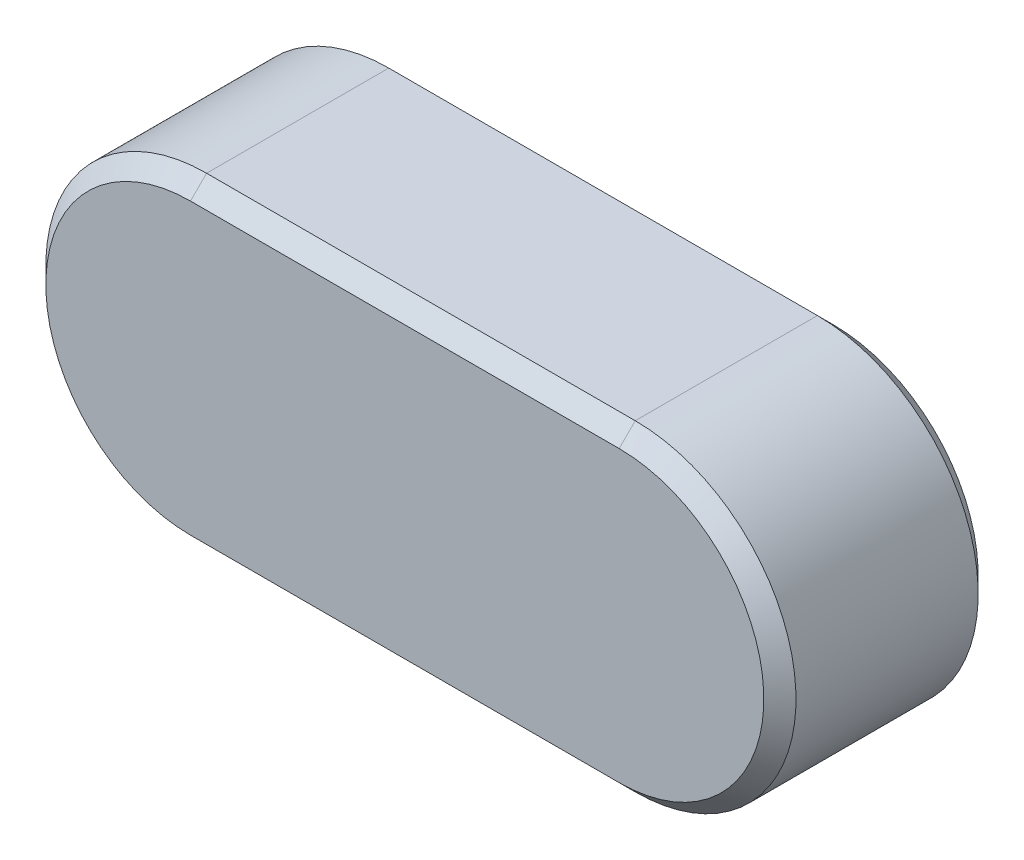
ISO-10303-21;
HEADER;
FILE_DESCRIPTION(('STEP AP214'),'2;1');
FILE_NAME('part.step','',(''),(''),'','','');
FILE_SCHEMA(('AUTOMOTIVE_DESIGN { 1 0 10303 214 1 1 1 1 }'));
ENDSEC;
DATA;
#1=APPLICATION_CONTEXT('core data for automotive mechanical design processes');
#2=APPLICATION_PROTOCOL_DEFINITION('international standard','automotive_design',2000,#1);
#3=PRODUCT_CONTEXT('',#1,'mechanical');
#4=PRODUCT('Part','Part','',(#3));
#5=PRODUCT_RELATED_PRODUCT_CATEGORY('part','',(#4));
#6=PRODUCT_DEFINITION_FORMATION('','',#4);
#7=PRODUCT_DEFINITION_CONTEXT('part definition',#1,'design');
#8=PRODUCT_DEFINITION('design','',#6,#7);
#9=PRODUCT_DEFINITION_SHAPE('','',#8);
#10=(LENGTH_UNIT() NAMED_UNIT(*) SI_UNIT(.MILLI.,.METRE.));
#11=(NAMED_UNIT(*) PLANE_ANGLE_UNIT() SI_UNIT($,.RADIAN.));
#12=(NAMED_UNIT(*) SI_UNIT($,.STERADIAN.) SOLID_ANGLE_UNIT());
#13=UNCERTAINTY_MEASURE_WITH_UNIT(LENGTH_MEASURE(1.E-05),#10,'distance_accuracy_value','');
#14=(GEOMETRIC_REPRESENTATION_CONTEXT(3) GLOBAL_UNCERTAINTY_ASSIGNED_CONTEXT((#13)) GLOBAL_UNIT_ASSIGNED_CONTEXT((#10,
#11,#12)) REPRESENTATION_CONTEXT('',''));
#15=CARTESIAN_POINT('',(0.,0.,0.));
#16=DIRECTION('',(0.,0.,1.));
#17=DIRECTION('',(1.,0.,0.));
#18=AXIS2_PLACEMENT_3D('',#15,#16,#17);
#19=CARTESIAN_POINT('',(-16.,0.,4.));
#20=DIRECTION('',(0.,0.,-1.));
#21=DIRECTION('',(-1.,0.,0.));
#22=AXIS2_PLACEMENT_3D('',#19,#20,#21);
#23=CYLINDRICAL_SURFACE('',#22,6.);
#24=DIRECTION('',(0.,0.,-1.));
#25=VECTOR('',#24,1.);
#26=CARTESIAN_POINT('',(-16.,-6.,4.));
#27=LINE('',#26,#25);
#28=CARTESIAN_POINT('',(-16.,-6.,3.4));
#29=VERTEX_POINT('',#28);
#30=CARTESIAN_POINT('',(-16.,-6.,-3.39999999999999));
#31=VERTEX_POINT('',#30);
#32=EDGE_CURVE('E123',#29,#31,#27,.T.);
#33=ORIENTED_EDGE('',*,*,#32,.F.);
#34=CARTESIAN_POINT('',(-16.,0.,3.4));
#35=DIRECTION('',(0.,0.,-1.));
#36=DIRECTION('',(-1.,0.,0.));
#37=AXIS2_PLACEMENT_3D('',#34,#35,#36);
#38=CIRCLE('',#37,6.);
#39=CARTESIAN_POINT('',(-16.,6.,3.4));
#40=VERTEX_POINT('',#39);
#41=EDGE_CURVE('E57',#29,#40,#38,.T.);
#42=ORIENTED_EDGE('',*,*,#41,.T.);
#43=DIRECTION('',(0.,0.,-1.));
#44=VECTOR('',#43,1.);
#45=CARTESIAN_POINT('',(-16.,6.,4.));
#46=LINE('',#45,#44);
#47=CARTESIAN_POINT('',(-16.,6.,-3.39999999999999));
#48=VERTEX_POINT('',#47);
#49=EDGE_CURVE('E161',#40,#48,#46,.T.);
#50=ORIENTED_EDGE('',*,*,#49,.T.);
#51=CARTESIAN_POINT('',(-16.,0.,-3.39999999999999));
#52=DIRECTION('',(0.,0.,-1.));
#53=DIRECTION('',(-1.,0.,0.));
#54=AXIS2_PLACEMENT_3D('',#51,#52,#53);
#55=CIRCLE('',#54,6.);
#56=EDGE_CURVE('E111',#48,#31,#55,.F.);
#57=ORIENTED_EDGE('',*,*,#56,.T.);
#58=EDGE_LOOP('',(#33,#42,#50,#57));
#59=FACE_BOUND('',#58,.T.);
#60=ADVANCED_FACE('F34',(#59),#23,.T.);
#61=CARTESIAN_POINT('',(0.,-6.,4.));
#62=DIRECTION('',(0.,1.,0.));
#63=DIRECTION('',(-1.,0.,0.));
#64=AXIS2_PLACEMENT_3D('',#61,#62,#63);
#65=PLANE('',#64);
#66=ORIENTED_EDGE('',*,*,#32,.T.);
#67=DIRECTION('',(1.,0.,0.));
#68=VECTOR('',#67,1.);
#69=CARTESIAN_POINT('',(0.,-6.,-3.39999999999999));
#70=LINE('',#69,#68);
#71=CARTESIAN_POINT('',(0.,-6.,-3.39999999999999));
#72=VERTEX_POINT('',#71);
#73=EDGE_CURVE('E122',#31,#72,#70,.T.);
#74=ORIENTED_EDGE('',*,*,#73,.T.);
#75=DIRECTION('',(0.,0.,-1.));
#76=VECTOR('',#75,1.);
#77=CARTESIAN_POINT('',(0.,-6.,4.));
#78=LINE('',#77,#76);
#79=CARTESIAN_POINT('',(0.,-6.,3.4));
#80=VERTEX_POINT('',#79);
#81=EDGE_CURVE('E105',#80,#72,#78,.T.);
#82=ORIENTED_EDGE('',*,*,#81,.F.);
#83=DIRECTION('',(-1.,0.,0.));
#84=VECTOR('',#83,1.);
#85=CARTESIAN_POINT('',(0.,-6.,3.4));
#86=LINE('',#85,#84);
#87=EDGE_CURVE('E120',#80,#29,#86,.T.);
#88=ORIENTED_EDGE('',*,*,#87,.T.);
#89=EDGE_LOOP('',(#66,#74,#82,#88));
#90=FACE_BOUND('',#89,.T.);
#91=ADVANCED_FACE('F119',(#90),#65,.F.);
#92=CARTESIAN_POINT('',(0.,0.,4.));
#93=DIRECTION('',(0.,0.,-1.));
#94=DIRECTION('',(-1.,0.,0.));
#95=AXIS2_PLACEMENT_3D('',#92,#93,#94);
#96=CYLINDRICAL_SURFACE('',#95,6.);
#97=DIRECTION('',(0.,0.,-1.));
#98=VECTOR('',#97,1.);
#99=CARTESIAN_POINT('',(0.,6.,4.));
#100=LINE('',#99,#98);
#101=CARTESIAN_POINT('',(0.,6.,3.4));
#102=VERTEX_POINT('',#101);
#103=CARTESIAN_POINT('',(0.,6.,-3.39999999999999));
#104=VERTEX_POINT('',#103);
#105=EDGE_CURVE('E106',#102,#104,#100,.T.);
#106=ORIENTED_EDGE('',*,*,#105,.F.);
#107=CARTESIAN_POINT('',(0.,0.,3.4));
#108=DIRECTION('',(0.,0.,-1.));
#109=DIRECTION('',(-1.,0.,0.));
#110=AXIS2_PLACEMENT_3D('',#107,#108,#109);
#111=CIRCLE('',#110,6.);
#112=EDGE_CURVE('E102',#102,#80,#111,.T.);
#113=ORIENTED_EDGE('',*,*,#112,.T.);
#114=ORIENTED_EDGE('',*,*,#81,.T.);
#115=CARTESIAN_POINT('',(0.,0.,-3.39999999999999));
#116=DIRECTION('',(0.,0.,-1.));
#117=DIRECTION('',(-1.,0.,0.));
#118=AXIS2_PLACEMENT_3D('',#115,#116,#117);
#119=CIRCLE('',#118,6.);
#120=EDGE_CURVE('E112',#72,#104,#119,.F.);
#121=ORIENTED_EDGE('',*,*,#120,.T.);
#122=EDGE_LOOP('',(#106,#113,#114,#121));
#123=FACE_BOUND('',#122,.T.);
#124=ADVANCED_FACE('F104',(#123),#96,.T.);
#125=CARTESIAN_POINT('',(-16.,6.,4.));
#126=DIRECTION('',(0.,-1.,0.));
#127=DIRECTION('',(1.,0.,0.));
#128=AXIS2_PLACEMENT_3D('',#125,#126,#127);
#129=PLANE('',#128);
#130=ORIENTED_EDGE('',*,*,#49,.F.);
#131=DIRECTION('',(1.,0.,0.));
#132=VECTOR('',#131,1.);
#133=CARTESIAN_POINT('',(-16.,6.,3.4));
#134=LINE('',#133,#132);
#135=EDGE_CURVE('E11',#40,#102,#134,.T.);
#136=ORIENTED_EDGE('',*,*,#135,.T.);
#137=ORIENTED_EDGE('',*,*,#105,.T.);
#138=DIRECTION('',(-1.,0.,0.));
#139=VECTOR('',#138,1.);
#140=CARTESIAN_POINT('',(-16.,6.,-3.39999999999999));
#141=LINE('',#140,#139);
#142=EDGE_CURVE('E43',#104,#48,#141,.T.);
#143=ORIENTED_EDGE('',*,*,#142,.T.);
#144=EDGE_LOOP('',(#130,#136,#137,#143));
#145=FACE_BOUND('',#144,.T.);
#146=ADVANCED_FACE('F211',(#145),#129,.F.);
#147=CARTESIAN_POINT('',(-16.,0.,4.));
#148=DIRECTION('',(0.,0.,-1.));
#149=DIRECTION('',(-1.,0.,0.));
#150=AXIS2_PLACEMENT_3D('',#147,#148,#149);
#151=PLANE('',#150);
#152=CARTESIAN_POINT('',(-16.,0.,4.));
#153=DIRECTION('',(0.,0.,-1.));
#154=DIRECTION('',(-1.,0.,0.));
#155=AXIS2_PLACEMENT_3D('',#152,#153,#154);
#156=CIRCLE('',#155,5.4);
#157=CARTESIAN_POINT('',(-16.,5.4,4.));
#158=VERTEX_POINT('',#157);
#159=CARTESIAN_POINT('',(-16.,-5.4,4.));
#160=VERTEX_POINT('',#159);
#161=EDGE_CURVE('E182',#158,#160,#156,.F.);
#162=ORIENTED_EDGE('',*,*,#161,.T.);
#163=DIRECTION('',(1.,0.,0.));
#164=VECTOR('',#163,1.);
#165=CARTESIAN_POINT('',(-16.,-5.4,4.));
#166=LINE('',#165,#164);
#167=CARTESIAN_POINT('',(0.,-5.4,4.));
#168=VERTEX_POINT('',#167);
#169=EDGE_CURVE('E185',#160,#168,#166,.T.);
#170=ORIENTED_EDGE('',*,*,#169,.T.);
#171=CARTESIAN_POINT('',(0.,0.,4.));
#172=DIRECTION('',(0.,0.,-1.));
#173=DIRECTION('',(-1.,0.,0.));
#174=AXIS2_PLACEMENT_3D('',#171,#172,#173);
#175=CIRCLE('',#174,5.4);
#176=CARTESIAN_POINT('',(0.,5.4,4.));
#177=VERTEX_POINT('',#176);
#178=EDGE_CURVE('E134',#168,#177,#175,.F.);
#179=ORIENTED_EDGE('',*,*,#178,.T.);
#180=DIRECTION('',(-1.,0.,0.));
#181=VECTOR('',#180,1.);
#182=CARTESIAN_POINT('',(-16.,5.4,4.));
#183=LINE('',#182,#181);
#184=EDGE_CURVE('E180',#177,#158,#183,.T.);
#185=ORIENTED_EDGE('',*,*,#184,.T.);
#186=EDGE_LOOP('',(#162,#170,#179,#185));
#187=FACE_BOUND('',#186,.T.);
#188=ADVANCED_FACE('F214',(#187),#151,.F.);
#189=CARTESIAN_POINT('',(-16.,0.,-4.));
#190=DIRECTION('',(0.,0.,-1.));
#191=DIRECTION('',(-1.,0.,0.));
#192=AXIS2_PLACEMENT_3D('',#189,#190,#191);
#193=PLANE('',#192);
#194=CARTESIAN_POINT('',(0.,0.,-4.));
#195=DIRECTION('',(0.,0.,-1.));
#196=DIRECTION('',(-1.,0.,0.));
#197=AXIS2_PLACEMENT_3D('',#194,#195,#196);
#198=CIRCLE('',#197,5.4);
#199=CARTESIAN_POINT('',(0.,5.4,-4.));
#200=VERTEX_POINT('',#199);
#201=CARTESIAN_POINT('',(0.,-5.4,-4.));
#202=VERTEX_POINT('',#201);
#203=EDGE_CURVE('E175',#200,#202,#198,.T.);
#204=ORIENTED_EDGE('',*,*,#203,.T.);
#205=DIRECTION('',(-1.,0.,0.));
#206=VECTOR('',#205,1.);
#207=CARTESIAN_POINT('',(-16.,-5.4,-4.));
#208=LINE('',#207,#206);
#209=CARTESIAN_POINT('',(-16.,-5.4,-4.));
#210=VERTEX_POINT('',#209);
#211=EDGE_CURVE('E177',#202,#210,#208,.T.);
#212=ORIENTED_EDGE('',*,*,#211,.T.);
#213=CARTESIAN_POINT('',(-16.,0.,-4.));
#214=DIRECTION('',(0.,0.,-1.));
#215=DIRECTION('',(-1.,0.,0.));
#216=AXIS2_PLACEMENT_3D('',#213,#214,#215);
#217=CIRCLE('',#216,5.4);
#218=CARTESIAN_POINT('',(-16.,5.4,-4.));
#219=VERTEX_POINT('',#218);
#220=EDGE_CURVE('E173',#210,#219,#217,.T.);
#221=ORIENTED_EDGE('',*,*,#220,.T.);
#222=DIRECTION('',(1.,0.,0.));
#223=VECTOR('',#222,1.);
#224=CARTESIAN_POINT('',(0.,5.4,-4.));
#225=LINE('',#224,#223);
#226=EDGE_CURVE('E171',#219,#200,#225,.T.);
#227=ORIENTED_EDGE('',*,*,#226,.T.);
#228=EDGE_LOOP('',(#204,#212,#221,#227));
#229=FACE_BOUND('',#228,.T.);
#230=ADVANCED_FACE('F215',(#229),#193,.T.);
#231=CARTESIAN_POINT('',(-16.,6.,-3.39999999999999));
#232=DIRECTION('',(0.,0.70710678118655,-0.707106781186545));
#233=DIRECTION('',(0.,0.707106781186545,0.70710678118655));
#234=AXIS2_PLACEMENT_3D('',#231,#232,#233);
#235=PLANE('',#234);
#236=DIRECTION('',(0.,0.707106781186545,0.70710678118655));
#237=VECTOR('',#236,1.);
#238=CARTESIAN_POINT('',(0.,5.4,-4.));
#239=LINE('',#238,#237);
#240=EDGE_CURVE('E153',#200,#104,#239,.T.);
#241=ORIENTED_EDGE('',*,*,#240,.F.);
#242=ORIENTED_EDGE('',*,*,#226,.F.);
#243=DIRECTION('',(0.,-0.707106781186545,-0.70710678118655));
#244=VECTOR('',#243,1.);
#245=CARTESIAN_POINT('',(-16.,6.,-3.39999999999999));
#246=LINE('',#245,#244);
#247=EDGE_CURVE('E140',#48,#219,#246,.T.);
#248=ORIENTED_EDGE('',*,*,#247,.F.);
#249=ORIENTED_EDGE('',*,*,#142,.F.);
#250=EDGE_LOOP('',(#241,#242,#248,#249));
#251=FACE_BOUND('',#250,.T.);
#252=ADVANCED_FACE('F218',(#251),#235,.T.);
#253=CARTESIAN_POINT('',(-16.,0.,-3.39999999999999));
#254=DIRECTION('',(0.,0.,1.));
#255=DIRECTION('',(1.,0.,0.));
#256=AXIS2_PLACEMENT_3D('',#253,#254,#255);
#257=CONICAL_SURFACE('',#256,6.,0.785398163397445);
#258=ORIENTED_EDGE('',*,*,#247,.T.);
#259=ORIENTED_EDGE('',*,*,#220,.F.);
#260=DIRECTION('',(0.,0.707106781186545,-0.70710678118655));
#261=VECTOR('',#260,1.);
#262=CARTESIAN_POINT('',(-16.,-6.,-3.39999999999999));
#263=LINE('',#262,#261);
#264=EDGE_CURVE('E147',#31,#210,#263,.T.);
#265=ORIENTED_EDGE('',*,*,#264,.F.);
#266=ORIENTED_EDGE('',*,*,#56,.F.);
#267=EDGE_LOOP('',(#258,#259,#265,#266));
#268=FACE_BOUND('',#267,.T.);
#269=ADVANCED_FACE('F190',(#268),#257,.T.);
#270=CARTESIAN_POINT('',(0.,0.,-3.39999999999999));
#271=DIRECTION('',(0.,0.,1.));
#272=DIRECTION('',(1.,0.,0.));
#273=AXIS2_PLACEMENT_3D('',#270,#271,#272);
#274=CONICAL_SURFACE('',#273,6.,0.785398163397445);
#275=ORIENTED_EDGE('',*,*,#240,.T.);
#276=ORIENTED_EDGE('',*,*,#120,.F.);
#277=DIRECTION('',(0.,-0.707106781186545,0.70710678118655));
#278=VECTOR('',#277,1.);
#279=CARTESIAN_POINT('',(0.,-5.4,-4.));
#280=LINE('',#279,#278);
#281=EDGE_CURVE('E143',#202,#72,#280,.T.);
#282=ORIENTED_EDGE('',*,*,#281,.F.);
#283=ORIENTED_EDGE('',*,*,#203,.F.);
#284=EDGE_LOOP('',(#275,#276,#282,#283));
#285=FACE_BOUND('',#284,.T.);
#286=ADVANCED_FACE('F193',(#285),#274,.T.);
#287=CARTESIAN_POINT('',(0.,-6.,-3.39999999999999));
#288=DIRECTION('',(0.,-0.70710678118655,-0.707106781186545));
#289=DIRECTION('',(0.,0.707106781186545,-0.70710678118655));
#290=AXIS2_PLACEMENT_3D('',#287,#288,#289);
#291=PLANE('',#290);
#292=ORIENTED_EDGE('',*,*,#264,.T.);
#293=ORIENTED_EDGE('',*,*,#211,.F.);
#294=ORIENTED_EDGE('',*,*,#281,.T.);
#295=ORIENTED_EDGE('',*,*,#73,.F.);
#296=EDGE_LOOP('',(#292,#293,#294,#295));
#297=FACE_BOUND('',#296,.T.);
#298=ADVANCED_FACE('F191',(#297),#291,.T.);
#299=CARTESIAN_POINT('',(-16.,5.4,4.));
#300=DIRECTION('',(0.,-0.707106781186547,-0.707106781186547));
#301=DIRECTION('',(0.,0.707106781186548,-0.707106781186548));
#302=AXIS2_PLACEMENT_3D('',#299,#300,#301);
#303=PLANE('',#302);
#304=DIRECTION('',(0.,-0.707106781186547,0.707106781186547));
#305=VECTOR('',#304,1.);
#306=CARTESIAN_POINT('',(0.,6.,3.4));
#307=LINE('',#306,#305);
#308=EDGE_CURVE('E137',#102,#177,#307,.T.);
#309=ORIENTED_EDGE('',*,*,#308,.F.);
#310=ORIENTED_EDGE('',*,*,#135,.F.);
#311=DIRECTION('',(0.,0.707106781186547,-0.707106781186547));
#312=VECTOR('',#311,1.);
#313=CARTESIAN_POINT('',(-16.,5.4,4.));
#314=LINE('',#313,#312);
#315=EDGE_CURVE('E38',#158,#40,#314,.T.);
#316=ORIENTED_EDGE('',*,*,#315,.F.);
#317=ORIENTED_EDGE('',*,*,#184,.F.);
#318=EDGE_LOOP('',(#309,#310,#316,#317));
#319=FACE_BOUND('',#318,.T.);
#320=ADVANCED_FACE('F36',(#319),#303,.F.);
#321=CARTESIAN_POINT('',(-16.,0.,4.));
#322=DIRECTION('',(0.,0.,-1.));
#323=DIRECTION('',(-1.,0.,0.));
#324=AXIS2_PLACEMENT_3D('',#321,#322,#323);
#325=CONICAL_SURFACE('',#324,5.4,0.785398163397448);
#326=ORIENTED_EDGE('',*,*,#315,.T.);
#327=ORIENTED_EDGE('',*,*,#41,.F.);
#328=DIRECTION('',(0.,-0.707106781186547,-0.707106781186547));
#329=VECTOR('',#328,1.);
#330=CARTESIAN_POINT('',(-16.,-5.4,4.));
#331=LINE('',#330,#329);
#332=EDGE_CURVE('E131',#160,#29,#331,.T.);
#333=ORIENTED_EDGE('',*,*,#332,.F.);
#334=ORIENTED_EDGE('',*,*,#161,.F.);
#335=EDGE_LOOP('',(#326,#327,#333,#334));
#336=FACE_BOUND('',#335,.T.);
#337=ADVANCED_FACE('F199',(#336),#325,.T.);
#338=CARTESIAN_POINT('',(0.,0.,4.));
#339=DIRECTION('',(0.,0.,-1.));
#340=DIRECTION('',(-1.,0.,0.));
#341=AXIS2_PLACEMENT_3D('',#338,#339,#340);
#342=CONICAL_SURFACE('',#341,5.4,0.785398163397448);
#343=ORIENTED_EDGE('',*,*,#308,.T.);
#344=ORIENTED_EDGE('',*,*,#178,.F.);
#345=DIRECTION('',(0.,0.707106781186547,0.707106781186547));
#346=VECTOR('',#345,1.);
#347=CARTESIAN_POINT('',(0.,-6.,3.4));
#348=LINE('',#347,#346);
#349=EDGE_CURVE('E128',#80,#168,#348,.T.);
#350=ORIENTED_EDGE('',*,*,#349,.F.);
#351=ORIENTED_EDGE('',*,*,#112,.F.);
#352=EDGE_LOOP('',(#343,#344,#350,#351));
#353=FACE_BOUND('',#352,.T.);
#354=ADVANCED_FACE('F133',(#353),#342,.T.);
#355=CARTESIAN_POINT('',(-16.,-5.4,4.));
#356=DIRECTION('',(0.,0.707106781186547,-0.707106781186547));
#357=DIRECTION('',(0.,0.707106781186548,0.707106781186548));
#358=AXIS2_PLACEMENT_3D('',#355,#356,#357);
#359=PLANE('',#358);
#360=ORIENTED_EDGE('',*,*,#332,.T.);
#361=ORIENTED_EDGE('',*,*,#87,.F.);
#362=ORIENTED_EDGE('',*,*,#349,.T.);
#363=ORIENTED_EDGE('',*,*,#169,.F.);
#364=EDGE_LOOP('',(#360,#361,#362,#363));
#365=FACE_BOUND('',#364,.T.);
#366=ADVANCED_FACE('F126',(#365),#359,.F.);
#367=CLOSED_SHELL('',(#60,#91,#124,#146,#188,#230,#252,#269,#286,#298,#320,#337,#354,#366));
#368=MANIFOLD_SOLID_BREP('B2',#367);
#369=ADVANCED_BREP_SHAPE_REPRESENTATION('',(#18,#368),#14);
#370=SHAPE_DEFINITION_REPRESENTATION(#9,#369);
ENDSEC;
END-ISO-10303-21;
